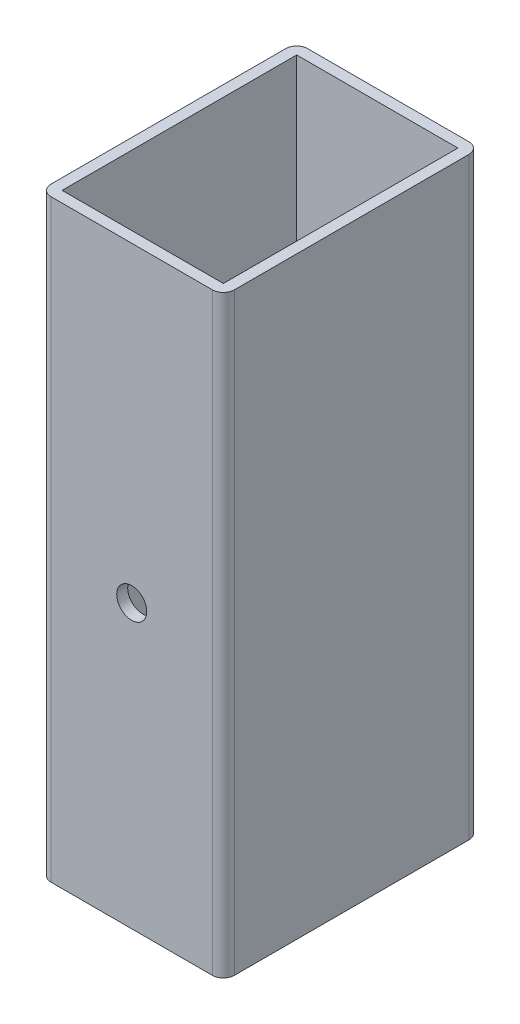
ISO-10303-21;
HEADER;
FILE_DESCRIPTION(('STEP AP214'),'2;1');
FILE_NAME('part.step','',(''),(''),'','','');
FILE_SCHEMA(('AUTOMOTIVE_DESIGN { 1 0 10303 214 1 1 1 1 }'));
ENDSEC;
DATA;
#1=APPLICATION_CONTEXT('core data for automotive mechanical design processes');
#2=APPLICATION_PROTOCOL_DEFINITION('international standard','automotive_design',2000,#1);
#3=PRODUCT_CONTEXT('',#1,'mechanical');
#4=PRODUCT('Part','Part','',(#3));
#5=PRODUCT_RELATED_PRODUCT_CATEGORY('part','',(#4));
#6=PRODUCT_DEFINITION_FORMATION('','',#4);
#7=PRODUCT_DEFINITION_CONTEXT('part definition',#1,'design');
#8=PRODUCT_DEFINITION('design','',#6,#7);
#9=PRODUCT_DEFINITION_SHAPE('','',#8);
#10=(LENGTH_UNIT() NAMED_UNIT(*) SI_UNIT(.MILLI.,.METRE.));
#11=(NAMED_UNIT(*) PLANE_ANGLE_UNIT() SI_UNIT($,.RADIAN.));
#12=(NAMED_UNIT(*) SI_UNIT($,.STERADIAN.) SOLID_ANGLE_UNIT());
#13=UNCERTAINTY_MEASURE_WITH_UNIT(LENGTH_MEASURE(1.E-05),#10,'distance_accuracy_value','');
#14=(GEOMETRIC_REPRESENTATION_CONTEXT(3) GLOBAL_UNCERTAINTY_ASSIGNED_CONTEXT((#13)) GLOBAL_UNIT_ASSIGNED_CONTEXT((#10,
#11,#12)) REPRESENTATION_CONTEXT('',''));
#15=CARTESIAN_POINT('',(0.,0.,0.));
#16=DIRECTION('',(0.,0.,1.));
#17=DIRECTION('',(1.,0.,0.));
#18=AXIS2_PLACEMENT_3D('',#15,#16,#17);
#19=CARTESIAN_POINT('',(50.,162.,70.));
#20=DIRECTION('',(0.,-1.,0.));
#21=DIRECTION('',(0.,0.,-1.));
#22=AXIS2_PLACEMENT_3D('',#19,#20,#21);
#23=PLANE('',#22);
#24=DIRECTION('',(-1.,0.,0.));
#25=VECTOR('',#24,1.);
#26=CARTESIAN_POINT('',(50.,162.,0.));
#27=LINE('',#26,#25);
#28=CARTESIAN_POINT('',(47.,162.,0.));
#29=VERTEX_POINT('',#28);
#30=CARTESIAN_POINT('',(3.,162.,0.));
#31=VERTEX_POINT('',#30);
#32=EDGE_CURVE('E172',#29,#31,#27,.T.);
#33=ORIENTED_EDGE('',*,*,#32,.T.);
#34=CARTESIAN_POINT('',(3.,162.,3.));
#35=DIRECTION('',(0.,-1.,0.));
#36=DIRECTION('',(0.,0.,-1.));
#37=AXIS2_PLACEMENT_3D('',#34,#35,#36);
#38=CIRCLE('',#37,3.);
#39=CARTESIAN_POINT('',(0.,162.,3.));
#40=VERTEX_POINT('',#39);
#41=EDGE_CURVE('E213',#31,#40,#38,.F.);
#42=ORIENTED_EDGE('',*,*,#41,.T.);
#43=DIRECTION('',(0.,0.,-1.));
#44=VECTOR('',#43,1.);
#45=CARTESIAN_POINT('',(0.,162.,70.));
#46=LINE('',#45,#44);
#47=CARTESIAN_POINT('',(0.,162.,67.));
#48=VERTEX_POINT('',#47);
#49=EDGE_CURVE('E175',#48,#40,#46,.T.);
#50=ORIENTED_EDGE('',*,*,#49,.F.);
#51=CARTESIAN_POINT('',(3.,162.,67.));
#52=DIRECTION('',(0.,-1.,0.));
#53=DIRECTION('',(0.,0.,-1.));
#54=AXIS2_PLACEMENT_3D('',#51,#52,#53);
#55=CIRCLE('',#54,3.);
#56=CARTESIAN_POINT('',(3.,162.,70.));
#57=VERTEX_POINT('',#56);
#58=EDGE_CURVE('E210',#48,#57,#55,.F.);
#59=ORIENTED_EDGE('',*,*,#58,.T.);
#60=DIRECTION('',(-1.,0.,0.));
#61=VECTOR('',#60,1.);
#62=CARTESIAN_POINT('',(50.,162.,70.));
#63=LINE('',#62,#61);
#64=CARTESIAN_POINT('',(47.,162.,70.));
#65=VERTEX_POINT('',#64);
#66=EDGE_CURVE('E171',#65,#57,#63,.T.);
#67=ORIENTED_EDGE('',*,*,#66,.F.);
#68=CARTESIAN_POINT('',(47.,162.,67.));
#69=DIRECTION('',(0.,-1.,0.));
#70=DIRECTION('',(0.,0.,-1.));
#71=AXIS2_PLACEMENT_3D('',#68,#69,#70);
#72=CIRCLE('',#71,3.);
#73=CARTESIAN_POINT('',(50.,162.,67.));
#74=VERTEX_POINT('',#73);
#75=EDGE_CURVE('E208',#65,#74,#72,.F.);
#76=ORIENTED_EDGE('',*,*,#75,.T.);
#77=DIRECTION('',(0.,0.,-1.));
#78=VECTOR('',#77,1.);
#79=CARTESIAN_POINT('',(50.,162.,70.));
#80=LINE('',#79,#78);
#81=CARTESIAN_POINT('',(50.,162.,3.));
#82=VERTEX_POINT('',#81);
#83=EDGE_CURVE('E182',#74,#82,#80,.T.);
#84=ORIENTED_EDGE('',*,*,#83,.T.);
#85=CARTESIAN_POINT('',(47.,162.,3.));
#86=DIRECTION('',(0.,-1.,0.));
#87=DIRECTION('',(0.,0.,-1.));
#88=AXIS2_PLACEMENT_3D('',#85,#86,#87);
#89=CIRCLE('',#88,3.);
#90=EDGE_CURVE('E63',#82,#29,#89,.F.);
#91=ORIENTED_EDGE('',*,*,#90,.T.);
#92=EDGE_LOOP('',(#33,#42,#50,#59,#67,#76,#84,#91));
#93=FACE_BOUND('',#92,.T.);
#94=DIRECTION('',(-1.,0.,0.));
#95=VECTOR('',#94,1.);
#96=CARTESIAN_POINT('',(50.,162.,3.));
#97=LINE('',#96,#95);
#98=CARTESIAN_POINT('',(47.,162.,3.));
#99=VERTEX_POINT('',#98);
#100=CARTESIAN_POINT('',(3.,162.,3.));
#101=VERTEX_POINT('',#100);
#102=EDGE_CURVE('E151',#99,#101,#97,.T.);
#103=ORIENTED_EDGE('',*,*,#102,.F.);
#104=DIRECTION('',(0.,0.,-1.));
#105=VECTOR('',#104,1.);
#106=CARTESIAN_POINT('',(47.,162.,70.));
#107=LINE('',#106,#105);
#108=CARTESIAN_POINT('',(47.,162.,67.));
#109=VERTEX_POINT('',#108);
#110=EDGE_CURVE('E164',#109,#99,#107,.T.);
#111=ORIENTED_EDGE('',*,*,#110,.F.);
#112=DIRECTION('',(-1.,0.,0.));
#113=VECTOR('',#112,1.);
#114=CARTESIAN_POINT('',(50.,162.,67.));
#115=LINE('',#114,#113);
#116=CARTESIAN_POINT('',(3.,162.,67.));
#117=VERTEX_POINT('',#116);
#118=EDGE_CURVE('E55',#109,#117,#115,.T.);
#119=ORIENTED_EDGE('',*,*,#118,.T.);
#120=DIRECTION('',(0.,0.,-1.));
#121=VECTOR('',#120,1.);
#122=CARTESIAN_POINT('',(3.,162.,70.));
#123=LINE('',#122,#121);
#124=EDGE_CURVE('E145',#117,#101,#123,.T.);
#125=ORIENTED_EDGE('',*,*,#124,.T.);
#126=EDGE_LOOP('',(#103,#111,#119,#125));
#127=FACE_BOUND('',#126,.T.);
#128=ADVANCED_FACE('F39',(#93,#127),#23,.F.);
#129=CARTESIAN_POINT('',(0.,162.,70.));
#130=DIRECTION('',(1.,0.,0.));
#131=DIRECTION('',(0.,0.,-1.));
#132=AXIS2_PLACEMENT_3D('',#129,#130,#131);
#133=PLANE('',#132);
#134=ORIENTED_EDGE('',*,*,#49,.T.);
#135=DIRECTION('',(0.,-1.,0.));
#136=VECTOR('',#135,1.);
#137=CARTESIAN_POINT('',(0.,162.,3.));
#138=LINE('',#137,#136);
#139=CARTESIAN_POINT('',(0.,0.,3.));
#140=VERTEX_POINT('',#139);
#141=EDGE_CURVE('E193',#40,#140,#138,.T.);
#142=ORIENTED_EDGE('',*,*,#141,.T.);
#143=DIRECTION('',(0.,0.,-1.));
#144=VECTOR('',#143,1.);
#145=CARTESIAN_POINT('',(0.,0.,70.));
#146=LINE('',#145,#144);
#147=CARTESIAN_POINT('',(0.,0.,67.));
#148=VERTEX_POINT('',#147);
#149=EDGE_CURVE('E188',#148,#140,#146,.T.);
#150=ORIENTED_EDGE('',*,*,#149,.F.);
#151=DIRECTION('',(0.,-1.,0.));
#152=VECTOR('',#151,1.);
#153=CARTESIAN_POINT('',(0.,162.,67.));
#154=LINE('',#153,#152);
#155=EDGE_CURVE('E191',#148,#48,#154,.F.);
#156=ORIENTED_EDGE('',*,*,#155,.T.);
#157=EDGE_LOOP('',(#134,#142,#150,#156));
#158=FACE_BOUND('',#157,.T.);
#159=ADVANCED_FACE('F255',(#158),#133,.F.);
#160=CARTESIAN_POINT('',(0.,0.,70.));
#161=DIRECTION('',(0.,1.,0.));
#162=DIRECTION('',(0.,0.,1.));
#163=AXIS2_PLACEMENT_3D('',#160,#161,#162);
#164=PLANE('',#163);
#165=ORIENTED_EDGE('',*,*,#149,.T.);
#166=CARTESIAN_POINT('',(3.,0.,3.));
#167=DIRECTION('',(0.,1.,0.));
#168=DIRECTION('',(0.,0.,1.));
#169=AXIS2_PLACEMENT_3D('',#166,#167,#168);
#170=CIRCLE('',#169,3.);
#171=CARTESIAN_POINT('',(3.,0.,0.));
#172=VERTEX_POINT('',#171);
#173=EDGE_CURVE('E202',#140,#172,#170,.F.);
#174=ORIENTED_EDGE('',*,*,#173,.T.);
#175=DIRECTION('',(1.,0.,0.));
#176=VECTOR('',#175,1.);
#177=CARTESIAN_POINT('',(0.,0.,0.));
#178=LINE('',#177,#176);
#179=CARTESIAN_POINT('',(47.,0.,0.));
#180=VERTEX_POINT('',#179);
#181=EDGE_CURVE('E163',#172,#180,#178,.T.);
#182=ORIENTED_EDGE('',*,*,#181,.T.);
#183=CARTESIAN_POINT('',(47.,0.,3.));
#184=DIRECTION('',(0.,1.,0.));
#185=DIRECTION('',(0.,0.,1.));
#186=AXIS2_PLACEMENT_3D('',#183,#184,#185);
#187=CIRCLE('',#186,3.);
#188=CARTESIAN_POINT('',(50.,0.,3.));
#189=VERTEX_POINT('',#188);
#190=EDGE_CURVE('E200',#180,#189,#187,.F.);
#191=ORIENTED_EDGE('',*,*,#190,.T.);
#192=DIRECTION('',(0.,0.,-1.));
#193=VECTOR('',#192,1.);
#194=CARTESIAN_POINT('',(50.,0.,70.));
#195=LINE('',#194,#193);
#196=CARTESIAN_POINT('',(50.,0.,67.));
#197=VERTEX_POINT('',#196);
#198=EDGE_CURVE('E185',#197,#189,#195,.T.);
#199=ORIENTED_EDGE('',*,*,#198,.F.);
#200=CARTESIAN_POINT('',(47.,0.,67.));
#201=DIRECTION('',(0.,1.,0.));
#202=DIRECTION('',(0.,0.,1.));
#203=AXIS2_PLACEMENT_3D('',#200,#201,#202);
#204=CIRCLE('',#203,3.);
#205=CARTESIAN_POINT('',(47.,0.,70.));
#206=VERTEX_POINT('',#205);
#207=EDGE_CURVE('E196',#197,#206,#204,.F.);
#208=ORIENTED_EDGE('',*,*,#207,.T.);
#209=DIRECTION('',(1.,0.,0.));
#210=VECTOR('',#209,1.);
#211=CARTESIAN_POINT('',(0.,0.,70.));
#212=LINE('',#211,#210);
#213=CARTESIAN_POINT('',(3.,0.,70.));
#214=VERTEX_POINT('',#213);
#215=EDGE_CURVE('E168',#214,#206,#212,.T.);
#216=ORIENTED_EDGE('',*,*,#215,.F.);
#217=CARTESIAN_POINT('',(3.,0.,67.));
#218=DIRECTION('',(0.,1.,0.));
#219=DIRECTION('',(0.,0.,1.));
#220=AXIS2_PLACEMENT_3D('',#217,#218,#219);
#221=CIRCLE('',#220,3.);
#222=EDGE_CURVE('E198',#214,#148,#221,.F.);
#223=ORIENTED_EDGE('',*,*,#222,.T.);
#224=EDGE_LOOP('',(#165,#174,#182,#191,#199,#208,#216,#223));
#225=FACE_BOUND('',#224,.T.);
#226=ADVANCED_FACE('F237',(#225),#164,.F.);
#227=CARTESIAN_POINT('',(50.,0.,70.));
#228=DIRECTION('',(-1.,0.,0.));
#229=DIRECTION('',(0.,0.,1.));
#230=AXIS2_PLACEMENT_3D('',#227,#228,#229);
#231=PLANE('',#230);
#232=ORIENTED_EDGE('',*,*,#198,.T.);
#233=DIRECTION('',(0.,1.,0.));
#234=VECTOR('',#233,1.);
#235=CARTESIAN_POINT('',(50.,0.,3.));
#236=LINE('',#235,#234);
#237=EDGE_CURVE('E217',#189,#82,#236,.T.);
#238=ORIENTED_EDGE('',*,*,#237,.T.);
#239=ORIENTED_EDGE('',*,*,#83,.F.);
#240=DIRECTION('',(0.,1.,0.));
#241=VECTOR('',#240,1.);
#242=CARTESIAN_POINT('',(50.,0.,67.));
#243=LINE('',#242,#241);
#244=EDGE_CURVE('E215',#74,#197,#243,.F.);
#245=ORIENTED_EDGE('',*,*,#244,.T.);
#246=EDGE_LOOP('',(#232,#238,#239,#245));
#247=FACE_BOUND('',#246,.T.);
#248=ADVANCED_FACE('F242',(#247),#231,.F.);
#249=CARTESIAN_POINT('',(0.,0.,70.));
#250=DIRECTION('',(0.,0.,1.));
#251=DIRECTION('',(1.,0.,0.));
#252=AXIS2_PLACEMENT_3D('',#249,#250,#251);
#253=PLANE('',#252);
#254=CARTESIAN_POINT('',(25.,77.,70.));
#255=DIRECTION('',(0.,0.,-1.));
#256=DIRECTION('',(-1.,0.,0.));
#257=AXIS2_PLACEMENT_3D('',#254,#255,#256);
#258=CIRCLE('',#257,4.1);
#259=CARTESIAN_POINT('',(20.9,77.,70.));
#260=VERTEX_POINT('',#259);
#261=EDGE_CURVE('E404',#260,#260,#258,.T.);
#262=ORIENTED_EDGE('',*,*,#261,.T.);
#263=EDGE_LOOP('',(#262));
#264=FACE_BOUND('',#263,.T.);
#265=ORIENTED_EDGE('',*,*,#66,.T.);
#266=DIRECTION('',(0.,-1.,0.));
#267=VECTOR('',#266,1.);
#268=CARTESIAN_POINT('',(3.,0.,70.));
#269=LINE('',#268,#267);
#270=EDGE_CURVE('E11',#57,#214,#269,.T.);
#271=ORIENTED_EDGE('',*,*,#270,.T.);
#272=ORIENTED_EDGE('',*,*,#215,.T.);
#273=DIRECTION('',(0.,1.,0.));
#274=VECTOR('',#273,1.);
#275=CARTESIAN_POINT('',(47.,162.,70.));
#276=LINE('',#275,#274);
#277=EDGE_CURVE('E48',#206,#65,#276,.T.);
#278=ORIENTED_EDGE('',*,*,#277,.T.);
#279=EDGE_LOOP('',(#265,#271,#272,#278));
#280=FACE_BOUND('',#279,.T.);
#281=ADVANCED_FACE('F223',(#264,#280),#253,.T.);
#282=CARTESIAN_POINT('',(0.,0.,0.));
#283=DIRECTION('',(0.,0.,1.));
#284=DIRECTION('',(1.,0.,0.));
#285=AXIS2_PLACEMENT_3D('',#282,#283,#284);
#286=PLANE('',#285);
#287=CARTESIAN_POINT('',(25.,77.,0.));
#288=DIRECTION('',(0.,0.,-1.));
#289=DIRECTION('',(-1.,0.,0.));
#290=AXIS2_PLACEMENT_3D('',#287,#288,#289);
#291=CIRCLE('',#290,4.1);
#292=CARTESIAN_POINT('',(20.9,77.,0.));
#293=VERTEX_POINT('',#292);
#294=EDGE_CURVE('E412',#293,#293,#291,.T.);
#295=ORIENTED_EDGE('',*,*,#294,.F.);
#296=EDGE_LOOP('',(#295));
#297=FACE_BOUND('',#296,.T.);
#298=ORIENTED_EDGE('',*,*,#181,.F.);
#299=DIRECTION('',(0.,-1.,0.));
#300=VECTOR('',#299,1.);
#301=CARTESIAN_POINT('',(3.,0.,0.));
#302=LINE('',#301,#300);
#303=EDGE_CURVE('E206',#172,#31,#302,.F.);
#304=ORIENTED_EDGE('',*,*,#303,.T.);
#305=ORIENTED_EDGE('',*,*,#32,.F.);
#306=DIRECTION('',(0.,1.,0.));
#307=VECTOR('',#306,1.);
#308=CARTESIAN_POINT('',(47.,0.,0.));
#309=LINE('',#308,#307);
#310=EDGE_CURVE('E204',#29,#180,#309,.F.);
#311=ORIENTED_EDGE('',*,*,#310,.T.);
#312=EDGE_LOOP('',(#298,#304,#305,#311));
#313=FACE_BOUND('',#312,.T.);
#314=ADVANCED_FACE('F247',(#297,#313),#286,.F.);
#315=CARTESIAN_POINT('',(3.,162.,3.));
#316=DIRECTION('',(0.,-1.,0.));
#317=DIRECTION('',(0.,0.,-1.));
#318=AXIS2_PLACEMENT_3D('',#315,#316,#317);
#319=CYLINDRICAL_SURFACE('',#318,3.);
#320=ORIENTED_EDGE('',*,*,#41,.F.);
#321=ORIENTED_EDGE('',*,*,#303,.F.);
#322=ORIENTED_EDGE('',*,*,#173,.F.);
#323=ORIENTED_EDGE('',*,*,#141,.F.);
#324=EDGE_LOOP('',(#320,#321,#322,#323));
#325=FACE_BOUND('',#324,.T.);
#326=ADVANCED_FACE('F252',(#325),#319,.T.);
#327=CARTESIAN_POINT('',(47.,0.,3.));
#328=DIRECTION('',(0.,1.,0.));
#329=DIRECTION('',(0.,0.,1.));
#330=AXIS2_PLACEMENT_3D('',#327,#328,#329);
#331=CYLINDRICAL_SURFACE('',#330,3.);
#332=ORIENTED_EDGE('',*,*,#190,.F.);
#333=ORIENTED_EDGE('',*,*,#310,.F.);
#334=ORIENTED_EDGE('',*,*,#90,.F.);
#335=ORIENTED_EDGE('',*,*,#237,.F.);
#336=EDGE_LOOP('',(#332,#333,#334,#335));
#337=FACE_BOUND('',#336,.T.);
#338=ADVANCED_FACE('F250',(#337),#331,.T.);
#339=CARTESIAN_POINT('',(3.,0.,67.));
#340=DIRECTION('',(0.,1.,0.));
#341=DIRECTION('',(0.,0.,1.));
#342=AXIS2_PLACEMENT_3D('',#339,#340,#341);
#343=CYLINDRICAL_SURFACE('',#342,3.);
#344=ORIENTED_EDGE('',*,*,#58,.F.);
#345=ORIENTED_EDGE('',*,*,#155,.F.);
#346=ORIENTED_EDGE('',*,*,#222,.F.);
#347=ORIENTED_EDGE('',*,*,#270,.F.);
#348=EDGE_LOOP('',(#344,#345,#346,#347));
#349=FACE_BOUND('',#348,.T.);
#350=ADVANCED_FACE('F235',(#349),#343,.T.);
#351=CARTESIAN_POINT('',(47.,0.,67.));
#352=DIRECTION('',(0.,-1.,0.));
#353=DIRECTION('',(0.,0.,-1.));
#354=AXIS2_PLACEMENT_3D('',#351,#352,#353);
#355=CYLINDRICAL_SURFACE('',#354,3.);
#356=ORIENTED_EDGE('',*,*,#207,.F.);
#357=ORIENTED_EDGE('',*,*,#244,.F.);
#358=ORIENTED_EDGE('',*,*,#75,.F.);
#359=ORIENTED_EDGE('',*,*,#277,.F.);
#360=EDGE_LOOP('',(#356,#357,#358,#359));
#361=FACE_BOUND('',#360,.T.);
#362=ADVANCED_FACE('F41',(#361),#355,.T.);
#363=CARTESIAN_POINT('',(3.,162.,70.));
#364=DIRECTION('',(1.,0.,0.));
#365=DIRECTION('',(0.,0.,-1.));
#366=AXIS2_PLACEMENT_3D('',#363,#364,#365);
#367=PLANE('',#366);
#368=ORIENTED_EDGE('',*,*,#124,.F.);
#369=DIRECTION('',(0.,1.,0.));
#370=VECTOR('',#369,1.);
#371=CARTESIAN_POINT('',(3.,0.,67.));
#372=LINE('',#371,#370);
#373=CARTESIAN_POINT('',(3.,3.,67.));
#374=VERTEX_POINT('',#373);
#375=EDGE_CURVE('E139',#374,#117,#372,.T.);
#376=ORIENTED_EDGE('',*,*,#375,.F.);
#377=DIRECTION('',(0.,0.,-1.));
#378=VECTOR('',#377,1.);
#379=CARTESIAN_POINT('',(3.,3.,70.));
#380=LINE('',#379,#378);
#381=CARTESIAN_POINT('',(3.,3.,3.));
#382=VERTEX_POINT('',#381);
#383=EDGE_CURVE('E130',#374,#382,#380,.T.);
#384=ORIENTED_EDGE('',*,*,#383,.T.);
#385=DIRECTION('',(0.,1.,0.));
#386=VECTOR('',#385,1.);
#387=CARTESIAN_POINT('',(3.,0.,3.));
#388=LINE('',#387,#386);
#389=EDGE_CURVE('E161',#382,#101,#388,.T.);
#390=ORIENTED_EDGE('',*,*,#389,.T.);
#391=EDGE_LOOP('',(#368,#376,#384,#390));
#392=FACE_BOUND('',#391,.T.);
#393=ADVANCED_FACE('F143',(#392),#367,.T.);
#394=CARTESIAN_POINT('',(0.,3.,70.));
#395=DIRECTION('',(0.,1.,0.));
#396=DIRECTION('',(0.,0.,1.));
#397=AXIS2_PLACEMENT_3D('',#394,#395,#396);
#398=PLANE('',#397);
#399=ORIENTED_EDGE('',*,*,#383,.F.);
#400=DIRECTION('',(1.,0.,0.));
#401=VECTOR('',#400,1.);
#402=CARTESIAN_POINT('',(0.,3.,67.));
#403=LINE('',#402,#401);
#404=CARTESIAN_POINT('',(47.,3.,67.));
#405=VERTEX_POINT('',#404);
#406=EDGE_CURVE('E134',#374,#405,#403,.T.);
#407=ORIENTED_EDGE('',*,*,#406,.T.);
#408=DIRECTION('',(0.,0.,-1.));
#409=VECTOR('',#408,1.);
#410=CARTESIAN_POINT('',(47.,3.,70.));
#411=LINE('',#410,#409);
#412=CARTESIAN_POINT('',(47.,3.,3.));
#413=VERTEX_POINT('',#412);
#414=EDGE_CURVE('E140',#405,#413,#411,.T.);
#415=ORIENTED_EDGE('',*,*,#414,.T.);
#416=DIRECTION('',(1.,0.,0.));
#417=VECTOR('',#416,1.);
#418=CARTESIAN_POINT('',(0.,3.,3.));
#419=LINE('',#418,#417);
#420=EDGE_CURVE('E136',#382,#413,#419,.T.);
#421=ORIENTED_EDGE('',*,*,#420,.F.);
#422=EDGE_LOOP('',(#399,#407,#415,#421));
#423=FACE_BOUND('',#422,.T.);
#424=ADVANCED_FACE('F132',(#423),#398,.T.);
#425=CARTESIAN_POINT('',(47.,0.,70.));
#426=DIRECTION('',(-1.,0.,0.));
#427=DIRECTION('',(0.,0.,1.));
#428=AXIS2_PLACEMENT_3D('',#425,#426,#427);
#429=PLANE('',#428);
#430=ORIENTED_EDGE('',*,*,#414,.F.);
#431=DIRECTION('',(0.,-1.,0.));
#432=VECTOR('',#431,1.);
#433=CARTESIAN_POINT('',(47.,0.,67.));
#434=LINE('',#433,#432);
#435=EDGE_CURVE('E149',#109,#405,#434,.T.);
#436=ORIENTED_EDGE('',*,*,#435,.F.);
#437=ORIENTED_EDGE('',*,*,#110,.T.);
#438=DIRECTION('',(0.,-1.,0.));
#439=VECTOR('',#438,1.);
#440=CARTESIAN_POINT('',(47.,0.,3.));
#441=LINE('',#440,#439);
#442=EDGE_CURVE('E146',#99,#413,#441,.T.);
#443=ORIENTED_EDGE('',*,*,#442,.T.);
#444=EDGE_LOOP('',(#430,#436,#437,#443));
#445=FACE_BOUND('',#444,.T.);
#446=ADVANCED_FACE('F280',(#445),#429,.T.);
#447=CARTESIAN_POINT('',(0.,0.,67.));
#448=DIRECTION('',(0.,0.,1.));
#449=DIRECTION('',(1.,0.,0.));
#450=AXIS2_PLACEMENT_3D('',#447,#448,#449);
#451=PLANE('',#450);
#452=CARTESIAN_POINT('',(25.,77.,67.));
#453=DIRECTION('',(0.,0.,1.));
#454=DIRECTION('',(1.,0.,0.));
#455=AXIS2_PLACEMENT_3D('',#452,#453,#454);
#456=CIRCLE('',#455,4.1);
#457=CARTESIAN_POINT('',(29.1,77.,67.));
#458=VERTEX_POINT('',#457);
#459=EDGE_CURVE('E407',#458,#458,#456,.T.);
#460=ORIENTED_EDGE('',*,*,#459,.T.);
#461=EDGE_LOOP('',(#460));
#462=FACE_BOUND('',#461,.T.);
#463=ORIENTED_EDGE('',*,*,#118,.F.);
#464=ORIENTED_EDGE('',*,*,#435,.T.);
#465=ORIENTED_EDGE('',*,*,#406,.F.);
#466=ORIENTED_EDGE('',*,*,#375,.T.);
#467=EDGE_LOOP('',(#463,#464,#465,#466));
#468=FACE_BOUND('',#467,.T.);
#469=ADVANCED_FACE('F148',(#462,#468),#451,.F.);
#470=CARTESIAN_POINT('',(0.,0.,3.));
#471=DIRECTION('',(0.,0.,1.));
#472=DIRECTION('',(1.,0.,0.));
#473=AXIS2_PLACEMENT_3D('',#470,#471,#472);
#474=PLANE('',#473);
#475=CARTESIAN_POINT('',(25.,77.,3.));
#476=DIRECTION('',(0.,0.,1.));
#477=DIRECTION('',(1.,0.,0.));
#478=AXIS2_PLACEMENT_3D('',#475,#476,#477);
#479=CIRCLE('',#478,4.1);
#480=CARTESIAN_POINT('',(29.1,77.,3.));
#481=VERTEX_POINT('',#480);
#482=EDGE_CURVE('E43',#481,#481,#479,.T.);
#483=ORIENTED_EDGE('',*,*,#482,.F.);
#484=EDGE_LOOP('',(#483));
#485=FACE_BOUND('',#484,.T.);
#486=ORIENTED_EDGE('',*,*,#420,.T.);
#487=ORIENTED_EDGE('',*,*,#442,.F.);
#488=ORIENTED_EDGE('',*,*,#102,.T.);
#489=ORIENTED_EDGE('',*,*,#389,.F.);
#490=EDGE_LOOP('',(#486,#487,#488,#489));
#491=FACE_BOUND('',#490,.T.);
#492=ADVANCED_FACE('F290',(#485,#491),#474,.T.);
#493=CARTESIAN_POINT('',(25.,77.,70.));
#494=DIRECTION('',(0.,0.,-1.));
#495=DIRECTION('',(-1.,0.,0.));
#496=AXIS2_PLACEMENT_3D('',#493,#494,#495);
#497=CYLINDRICAL_SURFACE('',#496,4.1);
#498=ORIENTED_EDGE('',*,*,#482,.T.);
#499=EDGE_LOOP('',(#498));
#500=FACE_BOUND('',#499,.T.);
#501=ORIENTED_EDGE('',*,*,#294,.T.);
#502=EDGE_LOOP('',(#501));
#503=FACE_BOUND('',#502,.T.);
#504=ADVANCED_FACE('F283',(#500,#503),#497,.F.);
#505=ORIENTED_EDGE('',*,*,#261,.F.);
#506=EDGE_LOOP('',(#505));
#507=FACE_BOUND('',#506,.T.);
#508=ORIENTED_EDGE('',*,*,#459,.F.);
#509=EDGE_LOOP('',(#508));
#510=FACE_BOUND('',#509,.T.);
#511=ADVANCED_FACE('F373',(#507,#510),#497,.F.);
#512=CLOSED_SHELL('',(#128,#159,#226,#248,#281,#314,#326,#338,#350,#362,#393,#424,#446,#469,
#492,#504,#511));
#513=MANIFOLD_SOLID_BREP('B2',#512);
#514=ADVANCED_BREP_SHAPE_REPRESENTATION('',(#18,#513),#14);
#515=SHAPE_DEFINITION_REPRESENTATION(#9,#514);
ENDSEC;
END-ISO-10303-21;
